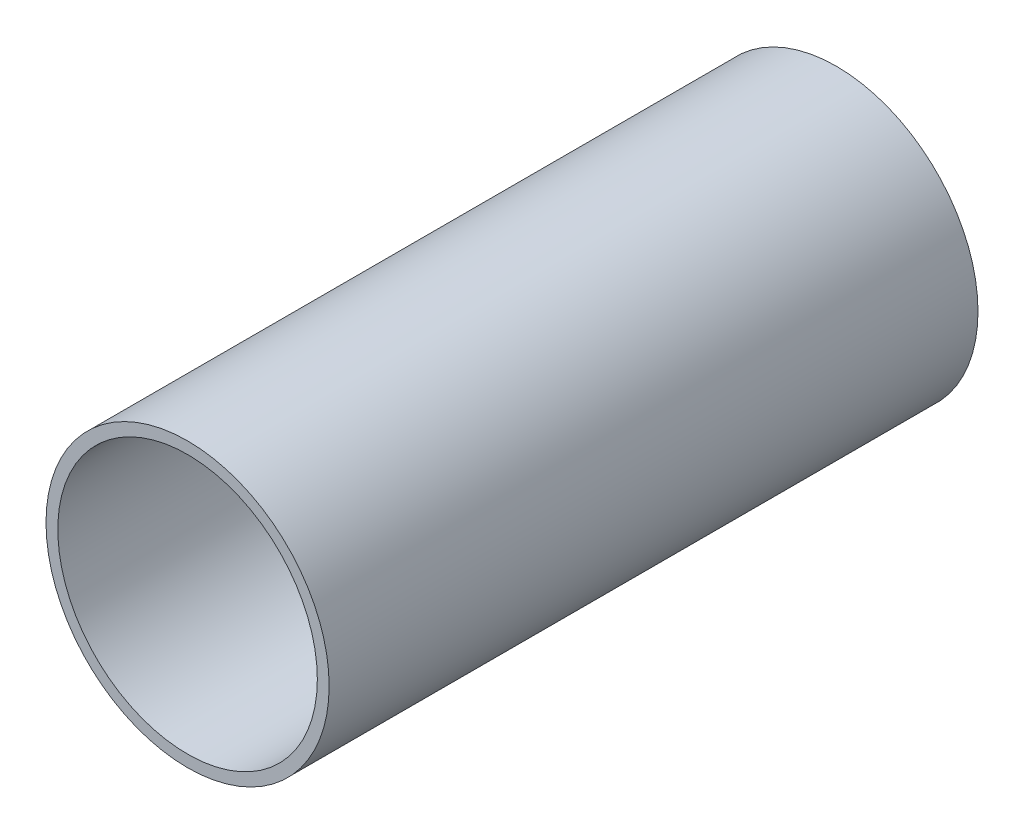
ISO-10303-21;
HEADER;
FILE_DESCRIPTION(('STEP AP214'),'2;1');
FILE_NAME('part.step','',(''),(''),'','','');
FILE_SCHEMA(('AUTOMOTIVE_DESIGN { 1 0 10303 214 1 1 1 1 }'));
ENDSEC;
DATA;
#1=APPLICATION_CONTEXT('core data for automotive mechanical design processes');
#2=APPLICATION_PROTOCOL_DEFINITION('international standard','automotive_design',2000,#1);
#3=PRODUCT_CONTEXT('',#1,'mechanical');
#4=PRODUCT('Part','Part','',(#3));
#5=PRODUCT_RELATED_PRODUCT_CATEGORY('part','',(#4));
#6=PRODUCT_DEFINITION_FORMATION('','',#4);
#7=PRODUCT_DEFINITION_CONTEXT('part definition',#1,'design');
#8=PRODUCT_DEFINITION('design','',#6,#7);
#9=PRODUCT_DEFINITION_SHAPE('','',#8);
#10=(LENGTH_UNIT() NAMED_UNIT(*) SI_UNIT(.MILLI.,.METRE.));
#11=(NAMED_UNIT(*) PLANE_ANGLE_UNIT() SI_UNIT($,.RADIAN.));
#12=(NAMED_UNIT(*) SI_UNIT($,.STERADIAN.) SOLID_ANGLE_UNIT());
#13=UNCERTAINTY_MEASURE_WITH_UNIT(LENGTH_MEASURE(1.E-05),#10,'distance_accuracy_value','');
#14=(GEOMETRIC_REPRESENTATION_CONTEXT(3) GLOBAL_UNCERTAINTY_ASSIGNED_CONTEXT((#13)) GLOBAL_UNIT_ASSIGNED_CONTEXT((#10,
#11,#12)) REPRESENTATION_CONTEXT('',''));
#15=CARTESIAN_POINT('',(0.,0.,0.));
#16=DIRECTION('',(0.,0.,1.));
#17=DIRECTION('',(1.,0.,0.));
#18=AXIS2_PLACEMENT_3D('',#15,#16,#17);
#19=CARTESIAN_POINT('',(0.,0.,174.625));
#20=DIRECTION('',(0.,0.,1.));
#21=DIRECTION('',(1.,0.,0.));
#22=AXIS2_PLACEMENT_3D('',#19,#20,#21);
#23=PLANE('',#22);
#24=CARTESIAN_POINT('',(0.,0.,174.625));
#25=DIRECTION('',(0.,0.,1.));
#26=DIRECTION('',(1.,0.,0.));
#27=AXIS2_PLACEMENT_3D('',#24,#25,#26);
#28=CIRCLE('',#27,38.1);
#29=CARTESIAN_POINT('',(38.1,0.,174.625));
#30=VERTEX_POINT('',#29);
#31=EDGE_CURVE('E10',#30,#30,#28,.T.);
#32=ORIENTED_EDGE('',*,*,#31,.T.);
#33=EDGE_LOOP('',(#32));
#34=FACE_BOUND('',#33,.T.);
#35=CARTESIAN_POINT('',(0.,0.,174.625));
#36=DIRECTION('',(0.,0.,1.));
#37=DIRECTION('',(1.,0.,0.));
#38=AXIS2_PLACEMENT_3D('',#35,#36,#37);
#39=CIRCLE('',#38,34.925);
#40=CARTESIAN_POINT('',(34.925,0.,174.625));
#41=VERTEX_POINT('',#40);
#42=EDGE_CURVE('E42',#41,#41,#39,.T.);
#43=ORIENTED_EDGE('',*,*,#42,.F.);
#44=EDGE_LOOP('',(#43));
#45=FACE_BOUND('',#44,.T.);
#46=ADVANCED_FACE('F31',(#34,#45),#23,.T.);
#47=CARTESIAN_POINT('',(0.,0.,0.));
#48=DIRECTION('',(0.,0.,1.));
#49=DIRECTION('',(1.,0.,0.));
#50=AXIS2_PLACEMENT_3D('',#47,#48,#49);
#51=PLANE('',#50);
#52=CARTESIAN_POINT('',(0.,0.,0.));
#53=DIRECTION('',(0.,0.,1.));
#54=DIRECTION('',(1.,0.,0.));
#55=AXIS2_PLACEMENT_3D('',#52,#53,#54);
#56=CIRCLE('',#55,38.1);
#57=CARTESIAN_POINT('',(38.1,0.,0.));
#58=VERTEX_POINT('',#57);
#59=EDGE_CURVE('E35',#58,#58,#56,.T.);
#60=ORIENTED_EDGE('',*,*,#59,.F.);
#61=EDGE_LOOP('',(#60));
#62=FACE_BOUND('',#61,.T.);
#63=CARTESIAN_POINT('',(0.,0.,0.));
#64=DIRECTION('',(0.,0.,1.));
#65=DIRECTION('',(1.,0.,0.));
#66=AXIS2_PLACEMENT_3D('',#63,#64,#65);
#67=CIRCLE('',#66,34.925);
#68=CARTESIAN_POINT('',(34.925,0.,0.));
#69=VERTEX_POINT('',#68);
#70=EDGE_CURVE('E44',#69,#69,#67,.T.);
#71=ORIENTED_EDGE('',*,*,#70,.T.);
#72=EDGE_LOOP('',(#71));
#73=FACE_BOUND('',#72,.T.);
#74=ADVANCED_FACE('F54',(#62,#73),#51,.F.);
#75=CARTESIAN_POINT('',(0.,0.,174.625));
#76=DIRECTION('',(0.,0.,-1.));
#77=DIRECTION('',(-1.,0.,0.));
#78=AXIS2_PLACEMENT_3D('',#75,#76,#77);
#79=CYLINDRICAL_SURFACE('',#78,38.1);
#80=ORIENTED_EDGE('',*,*,#31,.F.);
#81=EDGE_LOOP('',(#80));
#82=FACE_BOUND('',#81,.T.);
#83=ORIENTED_EDGE('',*,*,#59,.T.);
#84=EDGE_LOOP('',(#83));
#85=FACE_BOUND('',#84,.T.);
#86=ADVANCED_FACE('F33',(#82,#85),#79,.T.);
#87=CARTESIAN_POINT('',(0.,0.,174.625));
#88=DIRECTION('',(0.,0.,-1.));
#89=DIRECTION('',(-1.,0.,0.));
#90=AXIS2_PLACEMENT_3D('',#87,#88,#89);
#91=CYLINDRICAL_SURFACE('',#90,34.925);
#92=ORIENTED_EDGE('',*,*,#42,.T.);
#93=EDGE_LOOP('',(#92));
#94=FACE_BOUND('',#93,.T.);
#95=ORIENTED_EDGE('',*,*,#70,.F.);
#96=EDGE_LOOP('',(#95));
#97=FACE_BOUND('',#96,.T.);
#98=ADVANCED_FACE('F50',(#94,#97),#91,.F.);
#99=CLOSED_SHELL('',(#46,#74,#86,#98));
#100=MANIFOLD_SOLID_BREP('B2',#99);
#101=ADVANCED_BREP_SHAPE_REPRESENTATION('',(#18,#100),#14);
#102=SHAPE_DEFINITION_REPRESENTATION(#9,#101);
ENDSEC;
END-ISO-10303-21;
